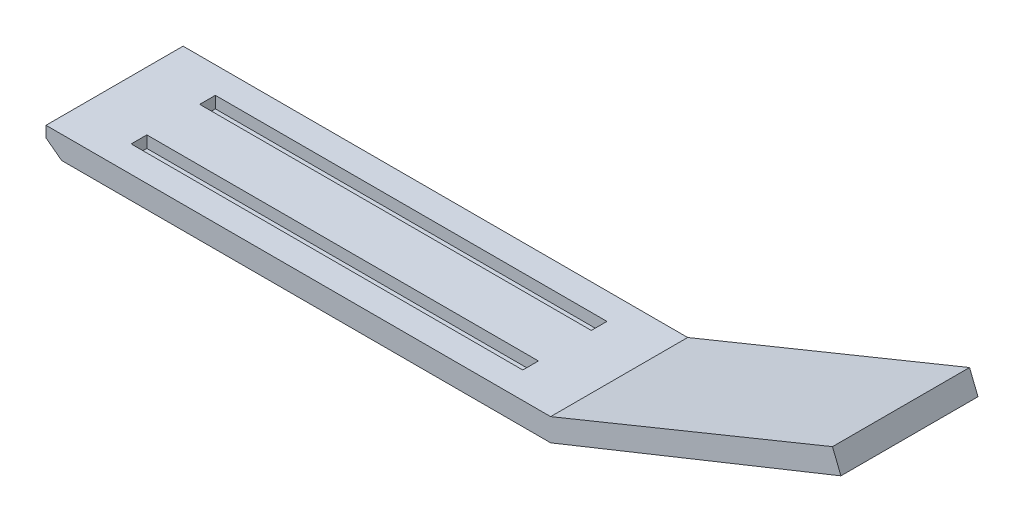
ISO-10303-21;
HEADER;
FILE_DESCRIPTION(('STEP AP214'),'2;1');
FILE_NAME('part.step','',(''),(''),'','','');
FILE_SCHEMA(('AUTOMOTIVE_DESIGN { 1 0 10303 214 1 1 1 1 }'));
ENDSEC;
DATA;
#1=APPLICATION_CONTEXT('core data for automotive mechanical design processes');
#2=APPLICATION_PROTOCOL_DEFINITION('international standard','automotive_design',2000,#1);
#3=PRODUCT_CONTEXT('',#1,'mechanical');
#4=PRODUCT('Part','Part','',(#3));
#5=PRODUCT_RELATED_PRODUCT_CATEGORY('part','',(#4));
#6=PRODUCT_DEFINITION_FORMATION('','',#4);
#7=PRODUCT_DEFINITION_CONTEXT('part definition',#1,'design');
#8=PRODUCT_DEFINITION('design','',#6,#7);
#9=PRODUCT_DEFINITION_SHAPE('','',#8);
#10=(LENGTH_UNIT() NAMED_UNIT(*) SI_UNIT(.MILLI.,.METRE.));
#11=(NAMED_UNIT(*) PLANE_ANGLE_UNIT() SI_UNIT($,.RADIAN.));
#12=(NAMED_UNIT(*) SI_UNIT($,.STERADIAN.) SOLID_ANGLE_UNIT());
#13=UNCERTAINTY_MEASURE_WITH_UNIT(LENGTH_MEASURE(1.E-05),#10,'distance_accuracy_value','');
#14=(GEOMETRIC_REPRESENTATION_CONTEXT(3) GLOBAL_UNCERTAINTY_ASSIGNED_CONTEXT((#13)) GLOBAL_UNIT_ASSIGNED_CONTEXT((#10,
#11,#12)) REPRESENTATION_CONTEXT('',''));
#15=CARTESIAN_POINT('',(0.,0.,0.));
#16=DIRECTION('',(0.,0.,1.));
#17=DIRECTION('',(1.,0.,0.));
#18=AXIS2_PLACEMENT_3D('',#15,#16,#17);
#19=CARTESIAN_POINT('',(0.,0.,350.));
#20=DIRECTION('',(0.,1.,0.));
#21=DIRECTION('',(0.,0.,1.));
#22=AXIS2_PLACEMENT_3D('',#19,#20,#21);
#23=PLANE('',#22);
#24=DIRECTION('',(1.,0.,0.));
#25=VECTOR('',#24,1.);
#26=CARTESIAN_POINT('',(0.,0.,350.));
#27=LINE('',#26,#25);
#28=CARTESIAN_POINT('',(-1248.66302067047,0.,350.));
#29=VERTEX_POINT('',#28);
#30=CARTESIAN_POINT('',(0.,0.,350.));
#31=VERTEX_POINT('',#30);
#32=EDGE_CURVE('E219',#29,#31,#27,.T.);
#33=ORIENTED_EDGE('',*,*,#32,.F.);
#34=DIRECTION('',(0.,0.,1.));
#35=VECTOR('',#34,1.);
#36=CARTESIAN_POINT('',(-1248.66302067047,0.,0.));
#37=LINE('',#36,#35);
#38=CARTESIAN_POINT('',(-1248.66302067047,0.,0.));
#39=VERTEX_POINT('',#38);
#40=EDGE_CURVE('E214',#39,#29,#37,.T.);
#41=ORIENTED_EDGE('',*,*,#40,.F.);
#42=DIRECTION('',(1.,0.,0.));
#43=VECTOR('',#42,1.);
#44=CARTESIAN_POINT('',(0.,0.,0.));
#45=LINE('',#44,#43);
#46=CARTESIAN_POINT('',(0.,0.,0.));
#47=VERTEX_POINT('',#46);
#48=EDGE_CURVE('E216',#39,#47,#45,.T.);
#49=ORIENTED_EDGE('',*,*,#48,.T.);
#50=DIRECTION('',(0.,0.,-1.));
#51=VECTOR('',#50,1.);
#52=CARTESIAN_POINT('',(0.,0.,350.));
#53=LINE('',#52,#51);
#54=EDGE_CURVE('E11',#31,#47,#53,.T.);
#55=ORIENTED_EDGE('',*,*,#54,.F.);
#56=EDGE_LOOP('',(#33,#41,#49,#55));
#57=FACE_BOUND('',#56,.T.);
#58=ADVANCED_FACE('F34',(#57),#23,.F.);
#59=CARTESIAN_POINT('',(0.,0.,350.));
#60=DIRECTION('',(-0.372566705450885,0.92800541484922,0.));
#61=DIRECTION('',(-0.928005414849221,-0.372566705450885,0.));
#62=AXIS2_PLACEMENT_3D('',#59,#60,#61);
#63=PLANE('',#62);
#64=DIRECTION('',(0.928005414849221,0.372566705450885,0.));
#65=VECTOR('',#64,1.);
#66=CARTESIAN_POINT('',(0.,0.,0.));
#67=LINE('',#66,#65);
#68=CARTESIAN_POINT('',(741.336979329526,297.624853905177,0.));
#69=VERTEX_POINT('',#68);
#70=EDGE_CURVE('E235',#47,#69,#67,.T.);
#71=ORIENTED_EDGE('',*,*,#70,.T.);
#72=DIRECTION('',(0.,0.,-1.));
#73=VECTOR('',#72,1.);
#74=CARTESIAN_POINT('',(741.336979329526,297.624853905177,350.));
#75=LINE('',#74,#73);
#76=CARTESIAN_POINT('',(741.336979329526,297.624853905177,350.));
#77=VERTEX_POINT('',#76);
#78=EDGE_CURVE('E41',#77,#69,#75,.T.);
#79=ORIENTED_EDGE('',*,*,#78,.F.);
#80=DIRECTION('',(0.928005414849221,0.372566705450885,0.));
#81=VECTOR('',#80,1.);
#82=CARTESIAN_POINT('',(0.,0.,350.));
#83=LINE('',#82,#81);
#84=EDGE_CURVE('E221',#31,#77,#83,.T.);
#85=ORIENTED_EDGE('',*,*,#84,.F.);
#86=ORIENTED_EDGE('',*,*,#54,.T.);
#87=EDGE_LOOP('',(#71,#79,#85,#86));
#88=FACE_BOUND('',#87,.T.);
#89=ADVANCED_FACE('F282',(#88),#63,.F.);
#90=CARTESIAN_POINT('',(741.336979329526,297.624853905177,350.));
#91=DIRECTION('',(-0.92800541484922,-0.372566705450885,0.));
#92=DIRECTION('',(0.372566705450885,-0.92800541484922,0.));
#93=AXIS2_PLACEMENT_3D('',#90,#91,#92);
#94=PLANE('',#93);
#95=DIRECTION('',(-0.372566705450885,0.92800541484922,0.));
#96=VECTOR('',#95,1.);
#97=CARTESIAN_POINT('',(741.336979329526,297.624853905177,0.));
#98=LINE('',#97,#96);
#99=CARTESIAN_POINT('',(719.728110413375,351.449167966431,0.));
#100=VERTEX_POINT('',#99);
#101=EDGE_CURVE('E237',#69,#100,#98,.T.);
#102=ORIENTED_EDGE('',*,*,#101,.T.);
#103=DIRECTION('',(0.,0.,-1.));
#104=VECTOR('',#103,1.);
#105=CARTESIAN_POINT('',(719.728110413375,351.449167966431,350.));
#106=LINE('',#105,#104);
#107=CARTESIAN_POINT('',(719.728110413375,351.449167966431,350.));
#108=VERTEX_POINT('',#107);
#109=EDGE_CURVE('E250',#108,#100,#106,.T.);
#110=ORIENTED_EDGE('',*,*,#109,.F.);
#111=DIRECTION('',(-0.372566705450885,0.92800541484922,0.));
#112=VECTOR('',#111,1.);
#113=CARTESIAN_POINT('',(741.336979329526,297.624853905177,350.));
#114=LINE('',#113,#112);
#115=EDGE_CURVE('E224',#77,#108,#114,.T.);
#116=ORIENTED_EDGE('',*,*,#115,.F.);
#117=ORIENTED_EDGE('',*,*,#78,.T.);
#118=EDGE_LOOP('',(#102,#110,#116,#117));
#119=FACE_BOUND('',#118,.T.);
#120=ADVANCED_FACE('F257',(#119),#94,.F.);
#121=CARTESIAN_POINT('',(719.728110413375,351.449167966431,350.));
#122=DIRECTION('',(0.377546916797029,-0.925990456547505,0.));
#123=DIRECTION('',(0.925990456547505,0.377546916797029,0.));
#124=AXIS2_PLACEMENT_3D('',#121,#122,#123);
#125=PLANE('',#124);
#126=DIRECTION('',(-0.925990456547505,-0.377546916797029,0.));
#127=VECTOR('',#126,1.);
#128=CARTESIAN_POINT('',(719.728110413375,351.449167966431,0.));
#129=LINE('',#128,#127);
#130=CARTESIAN_POINT('',(0.,58.,0.));
#131=VERTEX_POINT('',#130);
#132=EDGE_CURVE('E239',#100,#131,#129,.T.);
#133=ORIENTED_EDGE('',*,*,#132,.T.);
#134=DIRECTION('',(0.,0.,-1.));
#135=VECTOR('',#134,1.);
#136=CARTESIAN_POINT('',(0.,58.,350.));
#137=LINE('',#136,#135);
#138=CARTESIAN_POINT('',(0.,58.,350.));
#139=VERTEX_POINT('',#138);
#140=EDGE_CURVE('E247',#139,#131,#137,.T.);
#141=ORIENTED_EDGE('',*,*,#140,.F.);
#142=DIRECTION('',(-0.925990456547505,-0.377546916797029,0.));
#143=VECTOR('',#142,1.);
#144=CARTESIAN_POINT('',(719.728110413375,351.449167966431,350.));
#145=LINE('',#144,#143);
#146=EDGE_CURVE('E226',#108,#139,#145,.T.);
#147=ORIENTED_EDGE('',*,*,#146,.F.);
#148=ORIENTED_EDGE('',*,*,#109,.T.);
#149=EDGE_LOOP('',(#133,#141,#147,#148));
#150=FACE_BOUND('',#149,.T.);
#151=ADVANCED_FACE('F270',(#150),#125,.F.);
#152=CARTESIAN_POINT('',(0.,58.,350.));
#153=DIRECTION('',(0.,-1.,0.));
#154=DIRECTION('',(1.,0.,0.));
#155=AXIS2_PLACEMENT_3D('',#152,#153,#154);
#156=PLANE('',#155);
#157=DIRECTION('',(1.,0.,0.));
#158=VECTOR('',#157,1.);
#159=CARTESIAN_POINT('',(-1138.66302067047,58.,107.5));
#160=LINE('',#159,#158);
#161=CARTESIAN_POINT('',(-1138.66302067047,58.,107.5));
#162=VERTEX_POINT('',#161);
#163=CARTESIAN_POINT('',(-138.663020670474,58.,107.5));
#164=VERTEX_POINT('',#163);
#165=EDGE_CURVE('E169',#162,#164,#160,.T.);
#166=ORIENTED_EDGE('',*,*,#165,.F.);
#167=DIRECTION('',(0.,0.,1.));
#168=VECTOR('',#167,1.);
#169=CARTESIAN_POINT('',(-1138.66302067047,58.,67.5));
#170=LINE('',#169,#168);
#171=CARTESIAN_POINT('',(-1138.66302067047,58.,67.5));
#172=VERTEX_POINT('',#171);
#173=EDGE_CURVE('E48',#172,#162,#170,.T.);
#174=ORIENTED_EDGE('',*,*,#173,.F.);
#175=DIRECTION('',(-1.,0.,0.));
#176=VECTOR('',#175,1.);
#177=CARTESIAN_POINT('',(-1138.66302067047,58.,67.5));
#178=LINE('',#177,#176);
#179=CARTESIAN_POINT('',(-138.663020670474,58.,67.5));
#180=VERTEX_POINT('',#179);
#181=EDGE_CURVE('E160',#180,#172,#178,.T.);
#182=ORIENTED_EDGE('',*,*,#181,.F.);
#183=DIRECTION('',(0.,0.,-1.));
#184=VECTOR('',#183,1.);
#185=CARTESIAN_POINT('',(-138.663020670474,58.,67.5));
#186=LINE('',#185,#184);
#187=EDGE_CURVE('E163',#164,#180,#186,.T.);
#188=ORIENTED_EDGE('',*,*,#187,.F.);
#189=EDGE_LOOP('',(#166,#174,#182,#188));
#190=FACE_BOUND('',#189,.T.);
#191=DIRECTION('',(1.,0.,0.));
#192=VECTOR('',#191,1.);
#193=CARTESIAN_POINT('',(-1138.66302067047,58.,282.5));
#194=LINE('',#193,#192);
#195=CARTESIAN_POINT('',(-1138.66302067047,58.,282.5));
#196=VERTEX_POINT('',#195);
#197=CARTESIAN_POINT('',(-138.663020670474,58.,282.5));
#198=VERTEX_POINT('',#197);
#199=EDGE_CURVE('E195',#196,#198,#194,.T.);
#200=ORIENTED_EDGE('',*,*,#199,.F.);
#201=DIRECTION('',(0.,0.,1.));
#202=VECTOR('',#201,1.);
#203=CARTESIAN_POINT('',(-1138.66302067047,58.,242.5));
#204=LINE('',#203,#202);
#205=CARTESIAN_POINT('',(-1138.66302067047,58.,242.5));
#206=VERTEX_POINT('',#205);
#207=EDGE_CURVE('E56',#206,#196,#204,.T.);
#208=ORIENTED_EDGE('',*,*,#207,.F.);
#209=DIRECTION('',(-1.,0.,0.));
#210=VECTOR('',#209,1.);
#211=CARTESIAN_POINT('',(-1138.66302067047,58.,242.5));
#212=LINE('',#211,#210);
#213=CARTESIAN_POINT('',(-138.663020670474,58.,242.5));
#214=VERTEX_POINT('',#213);
#215=EDGE_CURVE('E184',#214,#206,#212,.T.);
#216=ORIENTED_EDGE('',*,*,#215,.F.);
#217=DIRECTION('',(0.,0.,-1.));
#218=VECTOR('',#217,1.);
#219=CARTESIAN_POINT('',(-138.663020670474,58.,242.5));
#220=LINE('',#219,#218);
#221=EDGE_CURVE('E198',#198,#214,#220,.T.);
#222=ORIENTED_EDGE('',*,*,#221,.F.);
#223=EDGE_LOOP('',(#200,#208,#216,#222));
#224=FACE_BOUND('',#223,.T.);
#225=DIRECTION('',(-1.,0.,0.));
#226=VECTOR('',#225,1.);
#227=CARTESIAN_POINT('',(0.,58.,0.));
#228=LINE('',#227,#226);
#229=CARTESIAN_POINT('',(-1288.66302067047,58.,0.));
#230=VERTEX_POINT('',#229);
#231=EDGE_CURVE('E241',#131,#230,#228,.T.);
#232=ORIENTED_EDGE('',*,*,#231,.T.);
#233=DIRECTION('',(0.,0.,-1.));
#234=VECTOR('',#233,1.);
#235=CARTESIAN_POINT('',(-1288.66302067047,58.,350.));
#236=LINE('',#235,#234);
#237=CARTESIAN_POINT('',(-1288.66302067047,58.,350.));
#238=VERTEX_POINT('',#237);
#239=EDGE_CURVE('E233',#238,#230,#236,.T.);
#240=ORIENTED_EDGE('',*,*,#239,.F.);
#241=DIRECTION('',(-1.,0.,0.));
#242=VECTOR('',#241,1.);
#243=CARTESIAN_POINT('',(0.,58.,350.));
#244=LINE('',#243,#242);
#245=EDGE_CURVE('E228',#139,#238,#244,.T.);
#246=ORIENTED_EDGE('',*,*,#245,.F.);
#247=ORIENTED_EDGE('',*,*,#140,.T.);
#248=EDGE_LOOP('',(#232,#240,#246,#247));
#249=FACE_BOUND('',#248,.T.);
#250=ADVANCED_FACE('F274',(#190,#224,#249),#156,.F.);
#251=CARTESIAN_POINT('',(-1288.66302067047,0.,350.));
#252=DIRECTION('',(1.,0.,0.));
#253=DIRECTION('',(0.,1.,0.));
#254=AXIS2_PLACEMENT_3D('',#251,#252,#253);
#255=PLANE('',#254);
#256=DIRECTION('',(0.,-1.,0.));
#257=VECTOR('',#256,1.);
#258=CARTESIAN_POINT('',(-1288.66302067047,0.,0.));
#259=LINE('',#258,#257);
#260=CARTESIAN_POINT('',(-1288.66302067047,30.,0.));
#261=VERTEX_POINT('',#260);
#262=EDGE_CURVE('E222',#230,#261,#259,.T.);
#263=ORIENTED_EDGE('',*,*,#262,.T.);
#264=DIRECTION('',(0.,0.,1.));
#265=VECTOR('',#264,1.);
#266=CARTESIAN_POINT('',(-1288.66302067047,30.,0.));
#267=LINE('',#266,#265);
#268=CARTESIAN_POINT('',(-1288.66302067047,30.,350.));
#269=VERTEX_POINT('',#268);
#270=EDGE_CURVE('E212',#261,#269,#267,.T.);
#271=ORIENTED_EDGE('',*,*,#270,.T.);
#272=DIRECTION('',(0.,-1.,0.));
#273=VECTOR('',#272,1.);
#274=CARTESIAN_POINT('',(-1288.66302067047,0.,350.));
#275=LINE('',#274,#273);
#276=EDGE_CURVE('E230',#238,#269,#275,.T.);
#277=ORIENTED_EDGE('',*,*,#276,.F.);
#278=ORIENTED_EDGE('',*,*,#239,.T.);
#279=EDGE_LOOP('',(#263,#271,#277,#278));
#280=FACE_BOUND('',#279,.T.);
#281=ADVANCED_FACE('F287',(#280),#255,.F.);
#282=CARTESIAN_POINT('',(0.,0.,350.));
#283=DIRECTION('',(0.,0.,-1.));
#284=DIRECTION('',(-1.,0.,0.));
#285=AXIS2_PLACEMENT_3D('',#282,#283,#284);
#286=PLANE('',#285);
#287=ORIENTED_EDGE('',*,*,#276,.T.);
#288=DIRECTION('',(-0.8,0.6,0.));
#289=VECTOR('',#288,1.);
#290=CARTESIAN_POINT('',(-1248.66302067047,0.,350.));
#291=LINE('',#290,#289);
#292=EDGE_CURVE('E176',#29,#269,#291,.T.);
#293=ORIENTED_EDGE('',*,*,#292,.F.);
#294=ORIENTED_EDGE('',*,*,#32,.T.);
#295=ORIENTED_EDGE('',*,*,#84,.T.);
#296=ORIENTED_EDGE('',*,*,#115,.T.);
#297=ORIENTED_EDGE('',*,*,#146,.T.);
#298=ORIENTED_EDGE('',*,*,#245,.T.);
#299=EDGE_LOOP('',(#287,#293,#294,#295,#296,#297,#298));
#300=FACE_BOUND('',#299,.T.);
#301=ADVANCED_FACE('F278',(#300),#286,.F.);
#302=CARTESIAN_POINT('',(0.,0.,0.));
#303=DIRECTION('',(0.,0.,-1.));
#304=DIRECTION('',(-1.,0.,0.));
#305=AXIS2_PLACEMENT_3D('',#302,#303,#304);
#306=PLANE('',#305);
#307=DIRECTION('',(-0.8,0.6,0.));
#308=VECTOR('',#307,1.);
#309=CARTESIAN_POINT('',(-1248.66302067047,0.,0.));
#310=LINE('',#309,#308);
#311=EDGE_CURVE('E209',#39,#261,#310,.T.);
#312=ORIENTED_EDGE('',*,*,#311,.T.);
#313=ORIENTED_EDGE('',*,*,#262,.F.);
#314=ORIENTED_EDGE('',*,*,#231,.F.);
#315=ORIENTED_EDGE('',*,*,#132,.F.);
#316=ORIENTED_EDGE('',*,*,#101,.F.);
#317=ORIENTED_EDGE('',*,*,#70,.F.);
#318=ORIENTED_EDGE('',*,*,#48,.F.);
#319=EDGE_LOOP('',(#312,#313,#314,#315,#316,#317,#318));
#320=FACE_BOUND('',#319,.T.);
#321=ADVANCED_FACE('F264',(#320),#306,.T.);
#322=CARTESIAN_POINT('',(-1248.66302067047,0.,0.));
#323=DIRECTION('',(0.6,0.8,0.));
#324=DIRECTION('',(-0.8,0.6,0.));
#325=AXIS2_PLACEMENT_3D('',#322,#323,#324);
#326=PLANE('',#325);
#327=ORIENTED_EDGE('',*,*,#292,.T.);
#328=ORIENTED_EDGE('',*,*,#270,.F.);
#329=ORIENTED_EDGE('',*,*,#311,.F.);
#330=ORIENTED_EDGE('',*,*,#40,.T.);
#331=EDGE_LOOP('',(#327,#328,#329,#330));
#332=FACE_BOUND('',#331,.T.);
#333=ADVANCED_FACE('F288',(#332),#326,.F.);
#334=CARTESIAN_POINT('',(-1138.66302067047,28.,242.5));
#335=DIRECTION('',(-1.,0.,0.));
#336=DIRECTION('',(0.,-1.,0.));
#337=AXIS2_PLACEMENT_3D('',#334,#335,#336);
#338=PLANE('',#337);
#339=ORIENTED_EDGE('',*,*,#207,.T.);
#340=DIRECTION('',(0.,1.,0.));
#341=VECTOR('',#340,1.);
#342=CARTESIAN_POINT('',(-1138.66302067047,28.,282.5));
#343=LINE('',#342,#341);
#344=CARTESIAN_POINT('',(-1138.66302067047,28.,282.5));
#345=VERTEX_POINT('',#344);
#346=EDGE_CURVE('E193',#345,#196,#343,.T.);
#347=ORIENTED_EDGE('',*,*,#346,.F.);
#348=DIRECTION('',(0.,0.,1.));
#349=VECTOR('',#348,1.);
#350=CARTESIAN_POINT('',(-1138.66302067047,28.,242.5));
#351=LINE('',#350,#349);
#352=CARTESIAN_POINT('',(-1138.66302067047,28.,242.5));
#353=VERTEX_POINT('',#352);
#354=EDGE_CURVE('E180',#353,#345,#351,.T.);
#355=ORIENTED_EDGE('',*,*,#354,.F.);
#356=DIRECTION('',(0.,1.,0.));
#357=VECTOR('',#356,1.);
#358=CARTESIAN_POINT('',(-1138.66302067047,28.,242.5));
#359=LINE('',#358,#357);
#360=EDGE_CURVE('E170',#353,#206,#359,.T.);
#361=ORIENTED_EDGE('',*,*,#360,.T.);
#362=EDGE_LOOP('',(#339,#347,#355,#361));
#363=FACE_BOUND('',#362,.T.);
#364=ADVANCED_FACE('F290',(#363),#338,.F.);
#365=CARTESIAN_POINT('',(-1138.66302067047,28.,242.5));
#366=DIRECTION('',(0.,0.,-1.));
#367=DIRECTION('',(-1.,0.,0.));
#368=AXIS2_PLACEMENT_3D('',#365,#366,#367);
#369=PLANE('',#368);
#370=ORIENTED_EDGE('',*,*,#215,.T.);
#371=ORIENTED_EDGE('',*,*,#360,.F.);
#372=DIRECTION('',(-1.,0.,0.));
#373=VECTOR('',#372,1.);
#374=CARTESIAN_POINT('',(-1138.66302067047,28.,242.5));
#375=LINE('',#374,#373);
#376=CARTESIAN_POINT('',(-138.663020670474,28.,242.5));
#377=VERTEX_POINT('',#376);
#378=EDGE_CURVE('E190',#377,#353,#375,.T.);
#379=ORIENTED_EDGE('',*,*,#378,.F.);
#380=DIRECTION('',(0.,1.,0.));
#381=VECTOR('',#380,1.);
#382=CARTESIAN_POINT('',(-138.663020670474,28.,242.5));
#383=LINE('',#382,#381);
#384=EDGE_CURVE('E204',#377,#214,#383,.T.);
#385=ORIENTED_EDGE('',*,*,#384,.T.);
#386=EDGE_LOOP('',(#370,#371,#379,#385));
#387=FACE_BOUND('',#386,.T.);
#388=ADVANCED_FACE('F296',(#387),#369,.F.);
#389=CARTESIAN_POINT('',(-138.663020670474,28.,242.5));
#390=DIRECTION('',(1.,0.,0.));
#391=DIRECTION('',(0.,1.,0.));
#392=AXIS2_PLACEMENT_3D('',#389,#390,#391);
#393=PLANE('',#392);
#394=ORIENTED_EDGE('',*,*,#221,.T.);
#395=ORIENTED_EDGE('',*,*,#384,.F.);
#396=DIRECTION('',(0.,0.,-1.));
#397=VECTOR('',#396,1.);
#398=CARTESIAN_POINT('',(-138.663020670474,28.,242.5));
#399=LINE('',#398,#397);
#400=CARTESIAN_POINT('',(-138.663020670474,28.,282.5));
#401=VERTEX_POINT('',#400);
#402=EDGE_CURVE('E187',#401,#377,#399,.T.);
#403=ORIENTED_EDGE('',*,*,#402,.F.);
#404=DIRECTION('',(0.,1.,0.));
#405=VECTOR('',#404,1.);
#406=CARTESIAN_POINT('',(-138.663020670474,28.,282.5));
#407=LINE('',#406,#405);
#408=EDGE_CURVE('E206',#401,#198,#407,.T.);
#409=ORIENTED_EDGE('',*,*,#408,.T.);
#410=EDGE_LOOP('',(#394,#395,#403,#409));
#411=FACE_BOUND('',#410,.T.);
#412=ADVANCED_FACE('F351',(#411),#393,.F.);
#413=CARTESIAN_POINT('',(-1138.66302067047,28.,282.5));
#414=DIRECTION('',(0.,0.,1.));
#415=DIRECTION('',(1.,0.,0.));
#416=AXIS2_PLACEMENT_3D('',#413,#414,#415);
#417=PLANE('',#416);
#418=ORIENTED_EDGE('',*,*,#199,.T.);
#419=ORIENTED_EDGE('',*,*,#408,.F.);
#420=DIRECTION('',(1.,0.,0.));
#421=VECTOR('',#420,1.);
#422=CARTESIAN_POINT('',(-1138.66302067047,28.,282.5));
#423=LINE('',#422,#421);
#424=EDGE_CURVE('E183',#345,#401,#423,.T.);
#425=ORIENTED_EDGE('',*,*,#424,.F.);
#426=ORIENTED_EDGE('',*,*,#346,.T.);
#427=EDGE_LOOP('',(#418,#419,#425,#426));
#428=FACE_BOUND('',#427,.T.);
#429=ADVANCED_FACE('F361',(#428),#417,.F.);
#430=CARTESIAN_POINT('',(0.,28.,0.));
#431=DIRECTION('',(0.,1.,0.));
#432=DIRECTION('',(-1.,0.,0.));
#433=AXIS2_PLACEMENT_3D('',#430,#431,#432);
#434=PLANE('',#433);
#435=ORIENTED_EDGE('',*,*,#354,.T.);
#436=ORIENTED_EDGE('',*,*,#424,.T.);
#437=ORIENTED_EDGE('',*,*,#402,.T.);
#438=ORIENTED_EDGE('',*,*,#378,.T.);
#439=EDGE_LOOP('',(#435,#436,#437,#438));
#440=FACE_BOUND('',#439,.T.);
#441=ADVANCED_FACE('F371',(#440),#434,.T.);
#442=CARTESIAN_POINT('',(-1138.66302067047,28.,67.5));
#443=DIRECTION('',(-1.,0.,0.));
#444=DIRECTION('',(0.,-1.,0.));
#445=AXIS2_PLACEMENT_3D('',#442,#443,#444);
#446=PLANE('',#445);
#447=ORIENTED_EDGE('',*,*,#173,.T.);
#448=DIRECTION('',(0.,1.,0.));
#449=VECTOR('',#448,1.);
#450=CARTESIAN_POINT('',(-1138.66302067047,28.,107.5));
#451=LINE('',#450,#449);
#452=CARTESIAN_POINT('',(-1138.66302067047,28.,107.5));
#453=VERTEX_POINT('',#452);
#454=EDGE_CURVE('E138',#453,#162,#451,.T.);
#455=ORIENTED_EDGE('',*,*,#454,.F.);
#456=DIRECTION('',(0.,0.,1.));
#457=VECTOR('',#456,1.);
#458=CARTESIAN_POINT('',(-1138.66302067047,28.,67.5));
#459=LINE('',#458,#457);
#460=CARTESIAN_POINT('',(-1138.66302067047,28.,67.5));
#461=VERTEX_POINT('',#460);
#462=EDGE_CURVE('E142',#461,#453,#459,.T.);
#463=ORIENTED_EDGE('',*,*,#462,.F.);
#464=DIRECTION('',(0.,1.,0.));
#465=VECTOR('',#464,1.);
#466=CARTESIAN_POINT('',(-1138.66302067047,28.,67.5));
#467=LINE('',#466,#465);
#468=EDGE_CURVE('E174',#461,#172,#467,.T.);
#469=ORIENTED_EDGE('',*,*,#468,.T.);
#470=EDGE_LOOP('',(#447,#455,#463,#469));
#471=FACE_BOUND('',#470,.T.);
#472=ADVANCED_FACE('F140',(#471),#446,.F.);
#473=CARTESIAN_POINT('',(-1138.66302067047,28.,67.5));
#474=DIRECTION('',(0.,0.,-1.));
#475=DIRECTION('',(-1.,0.,0.));
#476=AXIS2_PLACEMENT_3D('',#473,#474,#475);
#477=PLANE('',#476);
#478=ORIENTED_EDGE('',*,*,#181,.T.);
#479=ORIENTED_EDGE('',*,*,#468,.F.);
#480=DIRECTION('',(-1.,0.,0.));
#481=VECTOR('',#480,1.);
#482=CARTESIAN_POINT('',(-1138.66302067047,28.,67.5));
#483=LINE('',#482,#481);
#484=CARTESIAN_POINT('',(-138.663020670474,28.,67.5));
#485=VERTEX_POINT('',#484);
#486=EDGE_CURVE('E148',#485,#461,#483,.T.);
#487=ORIENTED_EDGE('',*,*,#486,.F.);
#488=DIRECTION('',(0.,1.,0.));
#489=VECTOR('',#488,1.);
#490=CARTESIAN_POINT('',(-138.663020670474,28.,67.5));
#491=LINE('',#490,#489);
#492=EDGE_CURVE('E177',#485,#180,#491,.T.);
#493=ORIENTED_EDGE('',*,*,#492,.T.);
#494=EDGE_LOOP('',(#478,#479,#487,#493));
#495=FACE_BOUND('',#494,.T.);
#496=ADVANCED_FACE('F390',(#495),#477,.F.);
#497=CARTESIAN_POINT('',(-138.663020670474,28.,67.5));
#498=DIRECTION('',(1.,0.,0.));
#499=DIRECTION('',(0.,1.,0.));
#500=AXIS2_PLACEMENT_3D('',#497,#498,#499);
#501=PLANE('',#500);
#502=ORIENTED_EDGE('',*,*,#187,.T.);
#503=ORIENTED_EDGE('',*,*,#492,.F.);
#504=DIRECTION('',(0.,0.,-1.));
#505=VECTOR('',#504,1.);
#506=CARTESIAN_POINT('',(-138.663020670474,28.,67.5));
#507=LINE('',#506,#505);
#508=CARTESIAN_POINT('',(-138.663020670474,28.,107.5));
#509=VERTEX_POINT('',#508);
#510=EDGE_CURVE('E156',#509,#485,#507,.T.);
#511=ORIENTED_EDGE('',*,*,#510,.F.);
#512=DIRECTION('',(0.,1.,0.));
#513=VECTOR('',#512,1.);
#514=CARTESIAN_POINT('',(-138.663020670474,28.,107.5));
#515=LINE('',#514,#513);
#516=EDGE_CURVE('E147',#509,#164,#515,.T.);
#517=ORIENTED_EDGE('',*,*,#516,.T.);
#518=EDGE_LOOP('',(#502,#503,#511,#517));
#519=FACE_BOUND('',#518,.T.);
#520=ADVANCED_FACE('F399',(#519),#501,.F.);
#521=CARTESIAN_POINT('',(-1138.66302067047,28.,107.5));
#522=DIRECTION('',(0.,0.,1.));
#523=DIRECTION('',(1.,0.,0.));
#524=AXIS2_PLACEMENT_3D('',#521,#522,#523);
#525=PLANE('',#524);
#526=ORIENTED_EDGE('',*,*,#165,.T.);
#527=ORIENTED_EDGE('',*,*,#516,.F.);
#528=DIRECTION('',(1.,0.,0.));
#529=VECTOR('',#528,1.);
#530=CARTESIAN_POINT('',(-1138.66302067047,28.,107.5));
#531=LINE('',#530,#529);
#532=EDGE_CURVE('E151',#453,#509,#531,.T.);
#533=ORIENTED_EDGE('',*,*,#532,.F.);
#534=ORIENTED_EDGE('',*,*,#454,.T.);
#535=EDGE_LOOP('',(#526,#527,#533,#534));
#536=FACE_BOUND('',#535,.T.);
#537=ADVANCED_FACE('F152',(#536),#525,.F.);
#538=CARTESIAN_POINT('',(0.,28.,0.));
#539=DIRECTION('',(0.,1.,0.));
#540=DIRECTION('',(-1.,0.,0.));
#541=AXIS2_PLACEMENT_3D('',#538,#539,#540);
#542=PLANE('',#541);
#543=ORIENTED_EDGE('',*,*,#462,.T.);
#544=ORIENTED_EDGE('',*,*,#532,.T.);
#545=ORIENTED_EDGE('',*,*,#510,.T.);
#546=ORIENTED_EDGE('',*,*,#486,.T.);
#547=EDGE_LOOP('',(#543,#544,#545,#546));
#548=FACE_BOUND('',#547,.T.);
#549=ADVANCED_FACE('F158',(#548),#542,.T.);
#550=CLOSED_SHELL('',(#58,#89,#120,#151,#250,#281,#301,#321,#333,#364,#388,#412,#429,#441,#472,
#496,#520,#537,#549));
#551=MANIFOLD_SOLID_BREP('B2',#550);
#552=ADVANCED_BREP_SHAPE_REPRESENTATION('',(#18,#551),#14);
#553=SHAPE_DEFINITION_REPRESENTATION(#9,#552);
ENDSEC;
END-ISO-10303-21;
